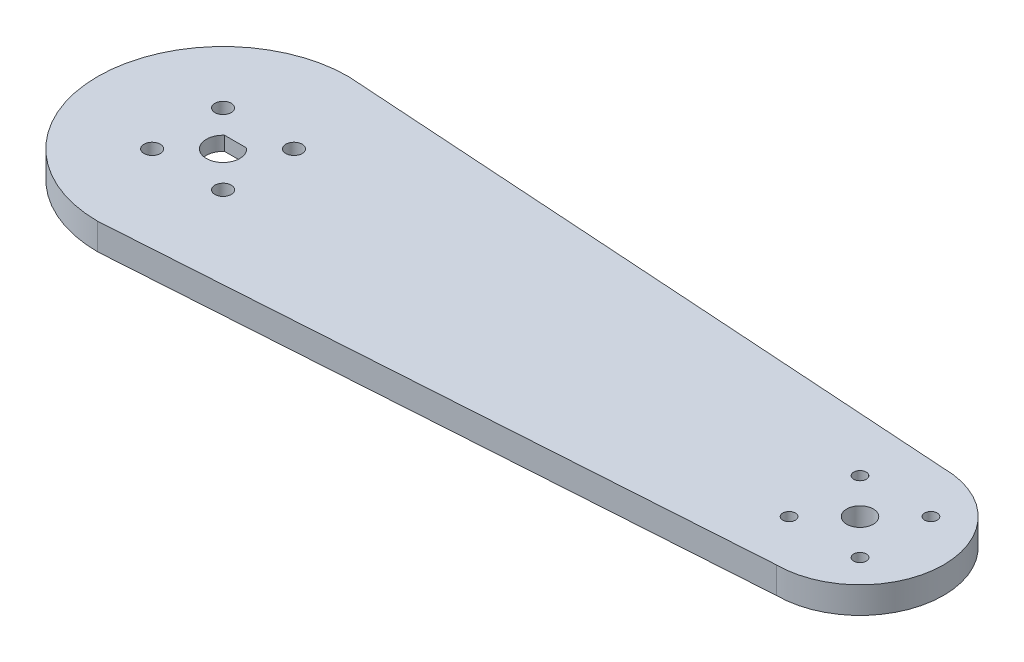
ISO-10303-21;
HEADER;
FILE_DESCRIPTION(('STEP AP214'),'2;1');
FILE_NAME('part.step','',(''),(''),'','','');
FILE_SCHEMA(('AUTOMOTIVE_DESIGN { 1 0 10303 214 1 1 1 1 }'));
ENDSEC;
DATA;
#1=APPLICATION_CONTEXT('core data for automotive mechanical design processes');
#2=APPLICATION_PROTOCOL_DEFINITION('international standard','automotive_design',2000,#1);
#3=PRODUCT_CONTEXT('',#1,'mechanical');
#4=PRODUCT('Part','Part','',(#3));
#5=PRODUCT_RELATED_PRODUCT_CATEGORY('part','',(#4));
#6=PRODUCT_DEFINITION_FORMATION('','',#4);
#7=PRODUCT_DEFINITION_CONTEXT('part definition',#1,'design');
#8=PRODUCT_DEFINITION('design','',#6,#7);
#9=PRODUCT_DEFINITION_SHAPE('','',#8);
#10=(LENGTH_UNIT() NAMED_UNIT(*) SI_UNIT(.MILLI.,.METRE.));
#11=(NAMED_UNIT(*) PLANE_ANGLE_UNIT() SI_UNIT($,.RADIAN.));
#12=(NAMED_UNIT(*) SI_UNIT($,.STERADIAN.) SOLID_ANGLE_UNIT());
#13=UNCERTAINTY_MEASURE_WITH_UNIT(LENGTH_MEASURE(1.E-05),#10,'distance_accuracy_value','');
#14=(GEOMETRIC_REPRESENTATION_CONTEXT(3) GLOBAL_UNCERTAINTY_ASSIGNED_CONTEXT((#13)) GLOBAL_UNIT_ASSIGNED_CONTEXT((#10,
#11,#12)) REPRESENTATION_CONTEXT('',''));
#15=CARTESIAN_POINT('',(0.,0.,0.));
#16=DIRECTION('',(0.,0.,1.));
#17=DIRECTION('',(1.,0.,0.));
#18=AXIS2_PLACEMENT_3D('',#15,#16,#17);
#19=CARTESIAN_POINT('',(0.,6.35,0.));
#20=DIRECTION('',(0.,-1.,0.));
#21=DIRECTION('',(0.,0.,-1.));
#22=AXIS2_PLACEMENT_3D('',#19,#20,#21);
#23=CYLINDRICAL_SURFACE('',#22,4.);
#24=CARTESIAN_POINT('',(0.,3.,0.));
#25=DIRECTION('',(0.,1.,0.));
#26=DIRECTION('',(0.,0.,1.));
#27=AXIS2_PLACEMENT_3D('',#24,#25,#26);
#28=CIRCLE('',#27,4.);
#29=CARTESIAN_POINT('',(-2.64575131106459,3.,-3.));
#30=VERTEX_POINT('',#29);
#31=CARTESIAN_POINT('',(2.64575131106459,3.,-3.));
#32=VERTEX_POINT('',#31);
#33=EDGE_CURVE('E53',#30,#32,#28,.T.);
#34=ORIENTED_EDGE('',*,*,#33,.F.);
#35=DIRECTION('',(0.,-1.,0.));
#36=VECTOR('',#35,1.);
#37=CARTESIAN_POINT('',(-2.64575131106459,6.35,-3.));
#38=LINE('',#37,#36);
#39=CARTESIAN_POINT('',(-2.64575131106459,6.35,-3.));
#40=VERTEX_POINT('',#39);
#41=EDGE_CURVE('E47',#40,#30,#38,.T.);
#42=ORIENTED_EDGE('',*,*,#41,.F.);
#43=CARTESIAN_POINT('',(0.,6.35,0.));
#44=DIRECTION('',(0.,1.,0.));
#45=DIRECTION('',(0.,0.,1.));
#46=AXIS2_PLACEMENT_3D('',#43,#44,#45);
#47=CIRCLE('',#46,4.);
#48=CARTESIAN_POINT('',(2.64575131106459,6.35,-3.));
#49=VERTEX_POINT('',#48);
#50=EDGE_CURVE('E109',#40,#49,#47,.T.);
#51=ORIENTED_EDGE('',*,*,#50,.T.);
#52=DIRECTION('',(0.,-1.,0.));
#53=VECTOR('',#52,1.);
#54=CARTESIAN_POINT('',(2.64575131106459,6.35,-3.));
#55=LINE('',#54,#53);
#56=EDGE_CURVE('E139',#49,#32,#55,.T.);
#57=ORIENTED_EDGE('',*,*,#56,.T.);
#58=EDGE_LOOP('',(#34,#42,#51,#57));
#59=FACE_BOUND('',#58,.T.);
#60=ADVANCED_FACE('F39',(#59),#23,.F.);
#61=CARTESIAN_POINT('',(1.96006475244537,6.35,29.8713868272674));
#62=DIRECTION('',(-0.0654759937515615,0.,-0.997854144773797));
#63=DIRECTION('',(-0.997854144773797,0.,0.0654759937515615));
#64=AXIS2_PLACEMENT_3D('',#61,#62,#63);
#65=PLANE('',#64);
#66=DIRECTION('',(0.997854144773797,0.,-0.0654759937515615));
#67=VECTOR('',#66,1.);
#68=CARTESIAN_POINT('',(1.96006475244537,0.,29.8713868272674));
#69=LINE('',#68,#67);
#70=CARTESIAN_POINT('',(0.,0.,30.));
#71=VERTEX_POINT('',#70);
#72=CARTESIAN_POINT('',(152.4,0.,20.));
#73=VERTEX_POINT('',#72);
#74=EDGE_CURVE('E131',#71,#73,#69,.T.);
#75=ORIENTED_EDGE('',*,*,#74,.T.);
#76=DIRECTION('',(0.,-1.,0.));
#77=VECTOR('',#76,1.);
#78=CARTESIAN_POINT('',(152.4,6.35,20.));
#79=LINE('',#78,#77);
#80=CARTESIAN_POINT('',(152.4,6.35,20.));
#81=VERTEX_POINT('',#80);
#82=EDGE_CURVE('E118',#81,#73,#79,.T.);
#83=ORIENTED_EDGE('',*,*,#82,.F.);
#84=DIRECTION('',(0.997854144773797,0.,-0.0654759937515615));
#85=VECTOR('',#84,1.);
#86=CARTESIAN_POINT('',(1.96006475244537,6.35,29.8713868272674));
#87=LINE('',#86,#85);
#88=CARTESIAN_POINT('',(0.,6.35,30.));
#89=VERTEX_POINT('',#88);
#90=EDGE_CURVE('E105',#89,#81,#87,.T.);
#91=ORIENTED_EDGE('',*,*,#90,.F.);
#92=DIRECTION('',(0.,-1.,0.));
#93=VECTOR('',#92,1.);
#94=CARTESIAN_POINT('',(0.,6.35,30.));
#95=LINE('',#94,#93);
#96=EDGE_CURVE('E111',#89,#71,#95,.T.);
#97=ORIENTED_EDGE('',*,*,#96,.T.);
#98=EDGE_LOOP('',(#75,#83,#91,#97));
#99=FACE_BOUND('',#98,.T.);
#100=ADVANCED_FACE('F41',(#99),#65,.F.);
#101=CARTESIAN_POINT('',(152.4,6.35,0.));
#102=DIRECTION('',(0.,-1.,0.));
#103=DIRECTION('',(0.,0.,-1.));
#104=AXIS2_PLACEMENT_3D('',#101,#102,#103);
#105=CYLINDRICAL_SURFACE('',#104,20.);
#106=CARTESIAN_POINT('',(152.4,0.,0.));
#107=DIRECTION('',(0.,1.,0.));
#108=DIRECTION('',(0.,0.,1.));
#109=AXIS2_PLACEMENT_3D('',#106,#107,#108);
#110=CIRCLE('',#109,20.);
#111=CARTESIAN_POINT('',(152.4,0.,-20.));
#112=VERTEX_POINT('',#111);
#113=EDGE_CURVE('E133',#73,#112,#110,.T.);
#114=ORIENTED_EDGE('',*,*,#113,.T.);
#115=DIRECTION('',(0.,-1.,0.));
#116=VECTOR('',#115,1.);
#117=CARTESIAN_POINT('',(152.4,6.35,-20.));
#118=LINE('',#117,#116);
#119=CARTESIAN_POINT('',(152.4,6.35,-20.));
#120=VERTEX_POINT('',#119);
#121=EDGE_CURVE('E145',#120,#112,#118,.T.);
#122=ORIENTED_EDGE('',*,*,#121,.F.);
#123=CARTESIAN_POINT('',(152.4,6.35,0.));
#124=DIRECTION('',(0.,1.,0.));
#125=DIRECTION('',(0.,0.,1.));
#126=AXIS2_PLACEMENT_3D('',#123,#124,#125);
#127=CIRCLE('',#126,20.);
#128=EDGE_CURVE('E91',#81,#120,#127,.T.);
#129=ORIENTED_EDGE('',*,*,#128,.F.);
#130=ORIENTED_EDGE('',*,*,#82,.T.);
#131=EDGE_LOOP('',(#114,#122,#129,#130));
#132=FACE_BOUND('',#131,.T.);
#133=ADVANCED_FACE('F232',(#132),#105,.T.);
#134=CARTESIAN_POINT('',(1.96006475244537,6.35,-29.8713868272674));
#135=DIRECTION('',(0.0654759937515615,0.,-0.997854144773797));
#136=DIRECTION('',(-0.997854144773797,0.,-0.0654759937515615));
#137=AXIS2_PLACEMENT_3D('',#134,#135,#136);
#138=PLANE('',#137);
#139=DIRECTION('',(0.997854144773797,0.,0.0654759937515615));
#140=VECTOR('',#139,1.);
#141=CARTESIAN_POINT('',(1.96006475244537,0.,-29.8713868272674));
#142=LINE('',#141,#140);
#143=CARTESIAN_POINT('',(0.,0.,-30.));
#144=VERTEX_POINT('',#143);
#145=EDGE_CURVE('E121',#144,#112,#142,.T.);
#146=ORIENTED_EDGE('',*,*,#145,.F.);
#147=DIRECTION('',(0.,-1.,0.));
#148=VECTOR('',#147,1.);
#149=CARTESIAN_POINT('',(0.,6.35,-30.));
#150=LINE('',#149,#148);
#151=CARTESIAN_POINT('',(0.,6.35,-30.));
#152=VERTEX_POINT('',#151);
#153=EDGE_CURVE('E116',#152,#144,#150,.T.);
#154=ORIENTED_EDGE('',*,*,#153,.F.);
#155=DIRECTION('',(0.997854144773797,0.,0.0654759937515615));
#156=VECTOR('',#155,1.);
#157=CARTESIAN_POINT('',(1.96006475244537,6.35,-29.8713868272674));
#158=LINE('',#157,#156);
#159=EDGE_CURVE('E108',#152,#120,#158,.T.);
#160=ORIENTED_EDGE('',*,*,#159,.T.);
#161=ORIENTED_EDGE('',*,*,#121,.T.);
#162=EDGE_LOOP('',(#146,#154,#160,#161));
#163=FACE_BOUND('',#162,.T.);
#164=ADVANCED_FACE('F234',(#163),#138,.T.);
#165=CARTESIAN_POINT('',(0.,6.35,0.));
#166=DIRECTION('',(0.,-1.,0.));
#167=DIRECTION('',(0.,0.,-1.));
#168=AXIS2_PLACEMENT_3D('',#165,#166,#167);
#169=CYLINDRICAL_SURFACE('',#168,30.);
#170=CARTESIAN_POINT('',(0.,0.,0.));
#171=DIRECTION('',(0.,1.,0.));
#172=DIRECTION('',(0.,0.,1.));
#173=AXIS2_PLACEMENT_3D('',#170,#171,#172);
#174=CIRCLE('',#173,30.);
#175=EDGE_CURVE('E82',#144,#71,#174,.T.);
#176=ORIENTED_EDGE('',*,*,#175,.T.);
#177=ORIENTED_EDGE('',*,*,#96,.F.);
#178=CARTESIAN_POINT('',(0.,6.35,0.));
#179=DIRECTION('',(0.,1.,0.));
#180=DIRECTION('',(0.,0.,1.));
#181=AXIS2_PLACEMENT_3D('',#178,#179,#180);
#182=CIRCLE('',#181,30.);
#183=EDGE_CURVE('E102',#152,#89,#182,.T.);
#184=ORIENTED_EDGE('',*,*,#183,.F.);
#185=ORIENTED_EDGE('',*,*,#153,.T.);
#186=EDGE_LOOP('',(#176,#177,#184,#185));
#187=FACE_BOUND('',#186,.T.);
#188=ADVANCED_FACE('F112',(#187),#169,.T.);
#189=CARTESIAN_POINT('',(0.,6.35,-3.));
#190=DIRECTION('',(0.,0.,-1.));
#191=DIRECTION('',(-1.,0.,0.));
#192=AXIS2_PLACEMENT_3D('',#189,#190,#191);
#193=PLANE('',#192);
#194=ORIENTED_EDGE('',*,*,#41,.T.);
#195=DIRECTION('',(1.,0.,0.));
#196=VECTOR('',#195,1.);
#197=CARTESIAN_POINT('',(0.,3.,-3.));
#198=LINE('',#197,#196);
#199=EDGE_CURVE('E11',#30,#32,#198,.T.);
#200=ORIENTED_EDGE('',*,*,#199,.T.);
#201=ORIENTED_EDGE('',*,*,#56,.F.);
#202=DIRECTION('',(1.,0.,0.));
#203=VECTOR('',#202,1.);
#204=CARTESIAN_POINT('',(0.,6.35,-3.));
#205=LINE('',#204,#203);
#206=EDGE_CURVE('E60',#40,#49,#205,.T.);
#207=ORIENTED_EDGE('',*,*,#206,.F.);
#208=EDGE_LOOP('',(#194,#200,#201,#207));
#209=FACE_BOUND('',#208,.T.);
#210=ADVANCED_FACE('F248',(#209),#193,.F.);
#211=CARTESIAN_POINT('',(0.,6.35,0.));
#212=DIRECTION('',(0.,1.,0.));
#213=DIRECTION('',(0.,0.,1.));
#214=AXIS2_PLACEMENT_3D('',#211,#212,#213);
#215=PLANE('',#214);
#216=CARTESIAN_POINT('',(160.885281374239,6.35,-8.4852813742386));
#217=DIRECTION('',(0.,-1.,0.));
#218=DIRECTION('',(-1.,0.,0.));
#219=AXIS2_PLACEMENT_3D('',#216,#217,#218);
#220=CIRCLE('',#219,1.5);
#221=CARTESIAN_POINT('',(159.385281374239,6.35,-8.48528137423859));
#222=VERTEX_POINT('',#221);
#223=EDGE_CURVE('E201',#222,#222,#220,.T.);
#224=ORIENTED_EDGE('',*,*,#223,.T.);
#225=EDGE_LOOP('',(#224));
#226=FACE_BOUND('',#225,.T.);
#227=CARTESIAN_POINT('',(143.914718625761,6.35,-8.48528137423859));
#228=DIRECTION('',(0.,-1.,0.));
#229=DIRECTION('',(0.,0.,1.));
#230=AXIS2_PLACEMENT_3D('',#227,#228,#229);
#231=CIRCLE('',#230,1.5);
#232=CARTESIAN_POINT('',(143.914718625761,6.35,-6.98528137423858));
#233=VERTEX_POINT('',#232);
#234=EDGE_CURVE('E194',#233,#233,#231,.T.);
#235=ORIENTED_EDGE('',*,*,#234,.T.);
#236=EDGE_LOOP('',(#235));
#237=FACE_BOUND('',#236,.T.);
#238=CARTESIAN_POINT('',(143.914718625762,6.35,8.48528137423865));
#239=DIRECTION('',(0.,-1.,0.));
#240=DIRECTION('',(1.,0.,0.));
#241=AXIS2_PLACEMENT_3D('',#238,#239,#240);
#242=CIRCLE('',#241,1.5);
#243=CARTESIAN_POINT('',(145.414718625762,6.35,8.48528137423864));
#244=VERTEX_POINT('',#243);
#245=EDGE_CURVE('E195',#244,#244,#242,.T.);
#246=ORIENTED_EDGE('',*,*,#245,.T.);
#247=EDGE_LOOP('',(#246));
#248=FACE_BOUND('',#247,.T.);
#249=CARTESIAN_POINT('',(160.885281374239,6.35,8.48528137423859));
#250=DIRECTION('',(0.,-1.,0.));
#251=DIRECTION('',(0.,0.,-1.));
#252=AXIS2_PLACEMENT_3D('',#249,#250,#251);
#253=CIRCLE('',#252,1.5);
#254=CARTESIAN_POINT('',(160.885281374239,6.35,6.98528137423858));
#255=VERTEX_POINT('',#254);
#256=EDGE_CURVE('E182',#255,#255,#253,.T.);
#257=ORIENTED_EDGE('',*,*,#256,.T.);
#258=EDGE_LOOP('',(#257));
#259=FACE_BOUND('',#258,.T.);
#260=CARTESIAN_POINT('',(-8.48528137423857,6.35,-8.48528137423856));
#261=DIRECTION('',(0.,-1.,0.));
#262=DIRECTION('',(0.,0.,-1.));
#263=AXIS2_PLACEMENT_3D('',#260,#261,#262);
#264=CIRCLE('',#263,1.95);
#265=CARTESIAN_POINT('',(-8.48528137423857,6.35,-10.4352813742386));
#266=VERTEX_POINT('',#265);
#267=EDGE_CURVE('E164',#266,#266,#264,.T.);
#268=ORIENTED_EDGE('',*,*,#267,.T.);
#269=EDGE_LOOP('',(#268));
#270=FACE_BOUND('',#269,.T.);
#271=CARTESIAN_POINT('',(8.48528137423857,6.35,8.48528137423857));
#272=DIRECTION('',(0.,-1.,0.));
#273=DIRECTION('',(0.,0.,-1.));
#274=AXIS2_PLACEMENT_3D('',#271,#272,#273);
#275=CIRCLE('',#274,1.95);
#276=CARTESIAN_POINT('',(8.48528137423857,6.35,6.53528137423857));
#277=VERTEX_POINT('',#276);
#278=EDGE_CURVE('E170',#277,#277,#275,.T.);
#279=ORIENTED_EDGE('',*,*,#278,.T.);
#280=EDGE_LOOP('',(#279));
#281=FACE_BOUND('',#280,.T.);
#282=CARTESIAN_POINT('',(-8.48528137423857,6.35,8.48528137423857));
#283=DIRECTION('',(0.,-1.,0.));
#284=DIRECTION('',(0.,0.,-1.));
#285=AXIS2_PLACEMENT_3D('',#282,#283,#284);
#286=CIRCLE('',#285,1.95);
#287=CARTESIAN_POINT('',(-8.48528137423857,6.35,6.53528137423857));
#288=VERTEX_POINT('',#287);
#289=EDGE_CURVE('E171',#288,#288,#286,.T.);
#290=ORIENTED_EDGE('',*,*,#289,.T.);
#291=EDGE_LOOP('',(#290));
#292=FACE_BOUND('',#291,.T.);
#293=CARTESIAN_POINT('',(8.48528137423856,6.35,-8.48528137423857));
#294=DIRECTION('',(0.,-1.,0.));
#295=DIRECTION('',(0.,0.,-1.));
#296=AXIS2_PLACEMENT_3D('',#293,#294,#295);
#297=CIRCLE('',#296,1.95);
#298=CARTESIAN_POINT('',(8.48528137423856,6.35,-10.4352813742386));
#299=VERTEX_POINT('',#298);
#300=EDGE_CURVE('E159',#299,#299,#297,.T.);
#301=ORIENTED_EDGE('',*,*,#300,.T.);
#302=EDGE_LOOP('',(#301));
#303=FACE_BOUND('',#302,.T.);
#304=CARTESIAN_POINT('',(152.4,6.35,0.));
#305=DIRECTION('',(0.,1.,0.));
#306=DIRECTION('',(0.,0.,1.));
#307=AXIS2_PLACEMENT_3D('',#304,#305,#306);
#308=CIRCLE('',#307,3.175);
#309=CARTESIAN_POINT('',(152.4,6.35,3.175));
#310=VERTEX_POINT('',#309);
#311=EDGE_CURVE('E124',#310,#310,#308,.T.);
#312=ORIENTED_EDGE('',*,*,#311,.F.);
#313=EDGE_LOOP('',(#312));
#314=FACE_BOUND('',#313,.T.);
#315=ORIENTED_EDGE('',*,*,#90,.T.);
#316=ORIENTED_EDGE('',*,*,#128,.T.);
#317=ORIENTED_EDGE('',*,*,#159,.F.);
#318=ORIENTED_EDGE('',*,*,#183,.T.);
#319=EDGE_LOOP('',(#315,#316,#317,#318));
#320=FACE_BOUND('',#319,.T.);
#321=ORIENTED_EDGE('',*,*,#50,.F.);
#322=ORIENTED_EDGE('',*,*,#206,.T.);
#323=EDGE_LOOP('',(#321,#322));
#324=FACE_BOUND('',#323,.T.);
#325=ADVANCED_FACE('F103',(#226,#237,#248,#259,#270,#281,#292,#303,#314,#320,#324),#215,.T.);
#326=CARTESIAN_POINT('',(0.,0.,0.));
#327=DIRECTION('',(0.,1.,0.));
#328=DIRECTION('',(0.,0.,1.));
#329=AXIS2_PLACEMENT_3D('',#326,#327,#328);
#330=PLANE('',#329);
#331=CARTESIAN_POINT('',(160.885281374239,0.,-8.4852813742386));
#332=DIRECTION('',(0.,-1.,0.));
#333=DIRECTION('',(-1.,0.,0.));
#334=AXIS2_PLACEMENT_3D('',#331,#332,#333);
#335=CIRCLE('',#334,1.5);
#336=CARTESIAN_POINT('',(159.385281374239,0.,-8.48528137423859));
#337=VERTEX_POINT('',#336);
#338=EDGE_CURVE('E190',#337,#337,#335,.T.);
#339=ORIENTED_EDGE('',*,*,#338,.F.);
#340=EDGE_LOOP('',(#339));
#341=FACE_BOUND('',#340,.T.);
#342=CARTESIAN_POINT('',(143.914718625761,0.,-8.48528137423859));
#343=DIRECTION('',(0.,-1.,0.));
#344=DIRECTION('',(0.,0.,1.));
#345=AXIS2_PLACEMENT_3D('',#342,#343,#344);
#346=CIRCLE('',#345,1.5);
#347=CARTESIAN_POINT('',(143.914718625761,0.,-6.98528137423858));
#348=VERTEX_POINT('',#347);
#349=EDGE_CURVE('E198',#348,#348,#346,.T.);
#350=ORIENTED_EDGE('',*,*,#349,.F.);
#351=EDGE_LOOP('',(#350));
#352=FACE_BOUND('',#351,.T.);
#353=CARTESIAN_POINT('',(143.914718625762,0.,8.48528137423865));
#354=DIRECTION('',(0.,-1.,0.));
#355=DIRECTION('',(1.,0.,0.));
#356=AXIS2_PLACEMENT_3D('',#353,#354,#355);
#357=CIRCLE('',#356,1.5);
#358=CARTESIAN_POINT('',(145.414718625762,0.,8.48528137423864));
#359=VERTEX_POINT('',#358);
#360=EDGE_CURVE('E191',#359,#359,#357,.T.);
#361=ORIENTED_EDGE('',*,*,#360,.F.);
#362=EDGE_LOOP('',(#361));
#363=FACE_BOUND('',#362,.T.);
#364=CARTESIAN_POINT('',(160.885281374239,0.,8.48528137423859));
#365=DIRECTION('',(0.,-1.,0.));
#366=DIRECTION('',(0.,0.,-1.));
#367=AXIS2_PLACEMENT_3D('',#364,#365,#366);
#368=CIRCLE('',#367,1.5);
#369=CARTESIAN_POINT('',(160.885281374239,0.,6.98528137423858));
#370=VERTEX_POINT('',#369);
#371=EDGE_CURVE('E187',#370,#370,#368,.T.);
#372=ORIENTED_EDGE('',*,*,#371,.F.);
#373=EDGE_LOOP('',(#372));
#374=FACE_BOUND('',#373,.T.);
#375=CARTESIAN_POINT('',(0.,0.,0.));
#376=DIRECTION('',(0.,1.,0.));
#377=DIRECTION('',(0.,0.,1.));
#378=AXIS2_PLACEMENT_3D('',#375,#376,#377);
#379=CIRCLE('',#378,16.);
#380=CARTESIAN_POINT('',(0.,0.,16.));
#381=VERTEX_POINT('',#380);
#382=EDGE_CURVE('E155',#381,#381,#379,.T.);
#383=ORIENTED_EDGE('',*,*,#382,.T.);
#384=EDGE_LOOP('',(#383));
#385=FACE_BOUND('',#384,.T.);
#386=CARTESIAN_POINT('',(152.4,0.,0.));
#387=DIRECTION('',(0.,1.,0.));
#388=DIRECTION('',(0.,0.,1.));
#389=AXIS2_PLACEMENT_3D('',#386,#387,#388);
#390=CIRCLE('',#389,3.175);
#391=CARTESIAN_POINT('',(152.4,0.,3.175));
#392=VERTEX_POINT('',#391);
#393=EDGE_CURVE('E134',#392,#392,#390,.T.);
#394=ORIENTED_EDGE('',*,*,#393,.T.);
#395=EDGE_LOOP('',(#394));
#396=FACE_BOUND('',#395,.T.);
#397=ORIENTED_EDGE('',*,*,#74,.F.);
#398=ORIENTED_EDGE('',*,*,#175,.F.);
#399=ORIENTED_EDGE('',*,*,#145,.T.);
#400=ORIENTED_EDGE('',*,*,#113,.F.);
#401=EDGE_LOOP('',(#397,#398,#399,#400));
#402=FACE_BOUND('',#401,.T.);
#403=ADVANCED_FACE('F218',(#341,#352,#363,#374,#385,#396,#402),#330,.F.);
#404=CARTESIAN_POINT('',(152.4,-3.65,0.));
#405=DIRECTION('',(0.,1.,0.));
#406=DIRECTION('',(0.,0.,1.));
#407=AXIS2_PLACEMENT_3D('',#404,#405,#406);
#408=CYLINDRICAL_SURFACE('',#407,3.175);
#409=ORIENTED_EDGE('',*,*,#311,.T.);
#410=EDGE_LOOP('',(#409));
#411=FACE_BOUND('',#410,.T.);
#412=ORIENTED_EDGE('',*,*,#393,.F.);
#413=EDGE_LOOP('',(#412));
#414=FACE_BOUND('',#413,.T.);
#415=ADVANCED_FACE('F221',(#411,#414),#408,.F.);
#416=CARTESIAN_POINT('',(0.,3.,0.));
#417=DIRECTION('',(0.,-1.,0.));
#418=DIRECTION('',(0.,0.,-1.));
#419=AXIS2_PLACEMENT_3D('',#416,#417,#418);
#420=CYLINDRICAL_SURFACE('',#419,16.);
#421=CARTESIAN_POINT('',(0.,3.,0.));
#422=DIRECTION('',(0.,1.,0.));
#423=DIRECTION('',(0.,0.,1.));
#424=AXIS2_PLACEMENT_3D('',#421,#422,#423);
#425=CIRCLE('',#424,16.);
#426=CARTESIAN_POINT('',(0.,3.,16.));
#427=VERTEX_POINT('',#426);
#428=EDGE_CURVE('E153',#427,#427,#425,.T.);
#429=ORIENTED_EDGE('',*,*,#428,.T.);
#430=EDGE_LOOP('',(#429));
#431=FACE_BOUND('',#430,.T.);
#432=ORIENTED_EDGE('',*,*,#382,.F.);
#433=EDGE_LOOP('',(#432));
#434=FACE_BOUND('',#433,.T.);
#435=ADVANCED_FACE('F262',(#431,#434),#420,.F.);
#436=CARTESIAN_POINT('',(0.,3.,0.));
#437=DIRECTION('',(0.,1.,0.));
#438=DIRECTION('',(0.,0.,1.));
#439=AXIS2_PLACEMENT_3D('',#436,#437,#438);
#440=PLANE('',#439);
#441=CARTESIAN_POINT('',(-8.48528137423857,3.,-8.48528137423856));
#442=DIRECTION('',(0.,-1.,0.));
#443=DIRECTION('',(0.,0.,-1.));
#444=AXIS2_PLACEMENT_3D('',#441,#442,#443);
#445=CIRCLE('',#444,1.95);
#446=CARTESIAN_POINT('',(-8.48528137423857,3.,-10.4352813742386));
#447=VERTEX_POINT('',#446);
#448=EDGE_CURVE('E174',#447,#447,#445,.T.);
#449=ORIENTED_EDGE('',*,*,#448,.F.);
#450=EDGE_LOOP('',(#449));
#451=FACE_BOUND('',#450,.T.);
#452=CARTESIAN_POINT('',(8.48528137423857,3.,8.48528137423857));
#453=DIRECTION('',(0.,-1.,0.));
#454=DIRECTION('',(0.,0.,-1.));
#455=AXIS2_PLACEMENT_3D('',#452,#453,#454);
#456=CIRCLE('',#455,1.95);
#457=CARTESIAN_POINT('',(8.48528137423857,3.,6.53528137423857));
#458=VERTEX_POINT('',#457);
#459=EDGE_CURVE('E167',#458,#458,#456,.T.);
#460=ORIENTED_EDGE('',*,*,#459,.F.);
#461=EDGE_LOOP('',(#460));
#462=FACE_BOUND('',#461,.T.);
#463=CARTESIAN_POINT('',(-8.48528137423857,3.,8.48528137423857));
#464=DIRECTION('',(0.,-1.,0.));
#465=DIRECTION('',(0.,0.,-1.));
#466=AXIS2_PLACEMENT_3D('',#463,#464,#465);
#467=CIRCLE('',#466,1.95);
#468=CARTESIAN_POINT('',(-8.48528137423857,3.,6.53528137423857));
#469=VERTEX_POINT('',#468);
#470=EDGE_CURVE('E179',#469,#469,#467,.T.);
#471=ORIENTED_EDGE('',*,*,#470,.F.);
#472=EDGE_LOOP('',(#471));
#473=FACE_BOUND('',#472,.T.);
#474=CARTESIAN_POINT('',(8.48528137423856,3.,-8.48528137423857));
#475=DIRECTION('',(0.,-1.,0.));
#476=DIRECTION('',(0.,0.,-1.));
#477=AXIS2_PLACEMENT_3D('',#474,#475,#476);
#478=CIRCLE('',#477,1.95);
#479=CARTESIAN_POINT('',(8.48528137423856,3.,-10.4352813742386));
#480=VERTEX_POINT('',#479);
#481=EDGE_CURVE('E161',#480,#480,#478,.T.);
#482=ORIENTED_EDGE('',*,*,#481,.F.);
#483=EDGE_LOOP('',(#482));
#484=FACE_BOUND('',#483,.T.);
#485=ORIENTED_EDGE('',*,*,#33,.T.);
#486=ORIENTED_EDGE('',*,*,#199,.F.);
#487=EDGE_LOOP('',(#485,#486));
#488=FACE_BOUND('',#487,.T.);
#489=ORIENTED_EDGE('',*,*,#428,.F.);
#490=EDGE_LOOP('',(#489));
#491=FACE_BOUND('',#490,.T.);
#492=ADVANCED_FACE('F258',(#451,#462,#473,#484,#488,#491),#440,.F.);
#493=CARTESIAN_POINT('',(8.48528137423856,6.35,-8.48528137423857));
#494=DIRECTION('',(0.,-1.,0.));
#495=DIRECTION('',(0.,0.,-1.));
#496=AXIS2_PLACEMENT_3D('',#493,#494,#495);
#497=CYLINDRICAL_SURFACE('',#496,1.95);
#498=ORIENTED_EDGE('',*,*,#300,.F.);
#499=EDGE_LOOP('',(#498));
#500=FACE_BOUND('',#499,.T.);
#501=ORIENTED_EDGE('',*,*,#481,.T.);
#502=EDGE_LOOP('',(#501));
#503=FACE_BOUND('',#502,.T.);
#504=ADVANCED_FACE('F261',(#500,#503),#497,.F.);
#505=CARTESIAN_POINT('',(-8.48528137423857,6.35,8.48528137423857));
#506=DIRECTION('',(0.,-1.,0.));
#507=DIRECTION('',(0.,0.,-1.));
#508=AXIS2_PLACEMENT_3D('',#505,#506,#507);
#509=CYLINDRICAL_SURFACE('',#508,1.95);
#510=ORIENTED_EDGE('',*,*,#289,.F.);
#511=EDGE_LOOP('',(#510));
#512=FACE_BOUND('',#511,.T.);
#513=ORIENTED_EDGE('',*,*,#470,.T.);
#514=EDGE_LOOP('',(#513));
#515=FACE_BOUND('',#514,.T.);
#516=ADVANCED_FACE('F277',(#512,#515),#509,.F.);
#517=CARTESIAN_POINT('',(8.48528137423857,6.35,8.48528137423857));
#518=DIRECTION('',(0.,-1.,0.));
#519=DIRECTION('',(0.,0.,-1.));
#520=AXIS2_PLACEMENT_3D('',#517,#518,#519);
#521=CYLINDRICAL_SURFACE('',#520,1.95);
#522=ORIENTED_EDGE('',*,*,#278,.F.);
#523=EDGE_LOOP('',(#522));
#524=FACE_BOUND('',#523,.T.);
#525=ORIENTED_EDGE('',*,*,#459,.T.);
#526=EDGE_LOOP('',(#525));
#527=FACE_BOUND('',#526,.T.);
#528=ADVANCED_FACE('F279',(#524,#527),#521,.F.);
#529=CARTESIAN_POINT('',(-8.48528137423857,6.35,-8.48528137423856));
#530=DIRECTION('',(0.,-1.,0.));
#531=DIRECTION('',(0.,0.,-1.));
#532=AXIS2_PLACEMENT_3D('',#529,#530,#531);
#533=CYLINDRICAL_SURFACE('',#532,1.95);
#534=ORIENTED_EDGE('',*,*,#267,.F.);
#535=EDGE_LOOP('',(#534));
#536=FACE_BOUND('',#535,.T.);
#537=ORIENTED_EDGE('',*,*,#448,.T.);
#538=EDGE_LOOP('',(#537));
#539=FACE_BOUND('',#538,.T.);
#540=ADVANCED_FACE('F282',(#536,#539),#533,.F.);
#541=CARTESIAN_POINT('',(160.885281374239,0.,8.48528137423859));
#542=DIRECTION('',(0.,-1.,0.));
#543=DIRECTION('',(0.,0.,-1.));
#544=AXIS2_PLACEMENT_3D('',#541,#542,#543);
#545=CYLINDRICAL_SURFACE('',#544,1.5);
#546=ORIENTED_EDGE('',*,*,#256,.F.);
#547=EDGE_LOOP('',(#546));
#548=FACE_BOUND('',#547,.T.);
#549=ORIENTED_EDGE('',*,*,#371,.T.);
#550=EDGE_LOOP('',(#549));
#551=FACE_BOUND('',#550,.T.);
#552=ADVANCED_FACE('F286',(#548,#551),#545,.F.);
#553=CARTESIAN_POINT('',(143.914718625762,0.,8.48528137423865));
#554=DIRECTION('',(0.,-1.,0.));
#555=DIRECTION('',(1.,0.,0.));
#556=AXIS2_PLACEMENT_3D('',#553,#554,#555);
#557=CYLINDRICAL_SURFACE('',#556,1.5);
#558=ORIENTED_EDGE('',*,*,#245,.F.);
#559=EDGE_LOOP('',(#558));
#560=FACE_BOUND('',#559,.T.);
#561=ORIENTED_EDGE('',*,*,#360,.T.);
#562=EDGE_LOOP('',(#561));
#563=FACE_BOUND('',#562,.T.);
#564=ADVANCED_FACE('F293',(#560,#563),#557,.F.);
#565=CARTESIAN_POINT('',(143.914718625761,0.,-8.48528137423859));
#566=DIRECTION('',(0.,-1.,0.));
#567=DIRECTION('',(0.,0.,1.));
#568=AXIS2_PLACEMENT_3D('',#565,#566,#567);
#569=CYLINDRICAL_SURFACE('',#568,1.5);
#570=ORIENTED_EDGE('',*,*,#234,.F.);
#571=EDGE_LOOP('',(#570));
#572=FACE_BOUND('',#571,.T.);
#573=ORIENTED_EDGE('',*,*,#349,.T.);
#574=EDGE_LOOP('',(#573));
#575=FACE_BOUND('',#574,.T.);
#576=ADVANCED_FACE('F214',(#572,#575),#569,.F.);
#577=CARTESIAN_POINT('',(160.885281374239,0.,-8.4852813742386));
#578=DIRECTION('',(0.,-1.,0.));
#579=DIRECTION('',(-1.,0.,0.));
#580=AXIS2_PLACEMENT_3D('',#577,#578,#579);
#581=CYLINDRICAL_SURFACE('',#580,1.5);
#582=ORIENTED_EDGE('',*,*,#223,.F.);
#583=EDGE_LOOP('',(#582));
#584=FACE_BOUND('',#583,.T.);
#585=ORIENTED_EDGE('',*,*,#338,.T.);
#586=EDGE_LOOP('',(#585));
#587=FACE_BOUND('',#586,.T.);
#588=ADVANCED_FACE('F211',(#584,#587),#581,.F.);
#589=CLOSED_SHELL('',(#60,#100,#133,#164,#188,#210,#325,#403,#415,#435,#492,#504,#516,#528,#540,
#552,#564,#576,#588));
#590=MANIFOLD_SOLID_BREP('B2',#589);
#591=ADVANCED_BREP_SHAPE_REPRESENTATION('',(#18,#590),#14);
#592=SHAPE_DEFINITION_REPRESENTATION(#9,#591);
ENDSEC;
END-ISO-10303-21;
